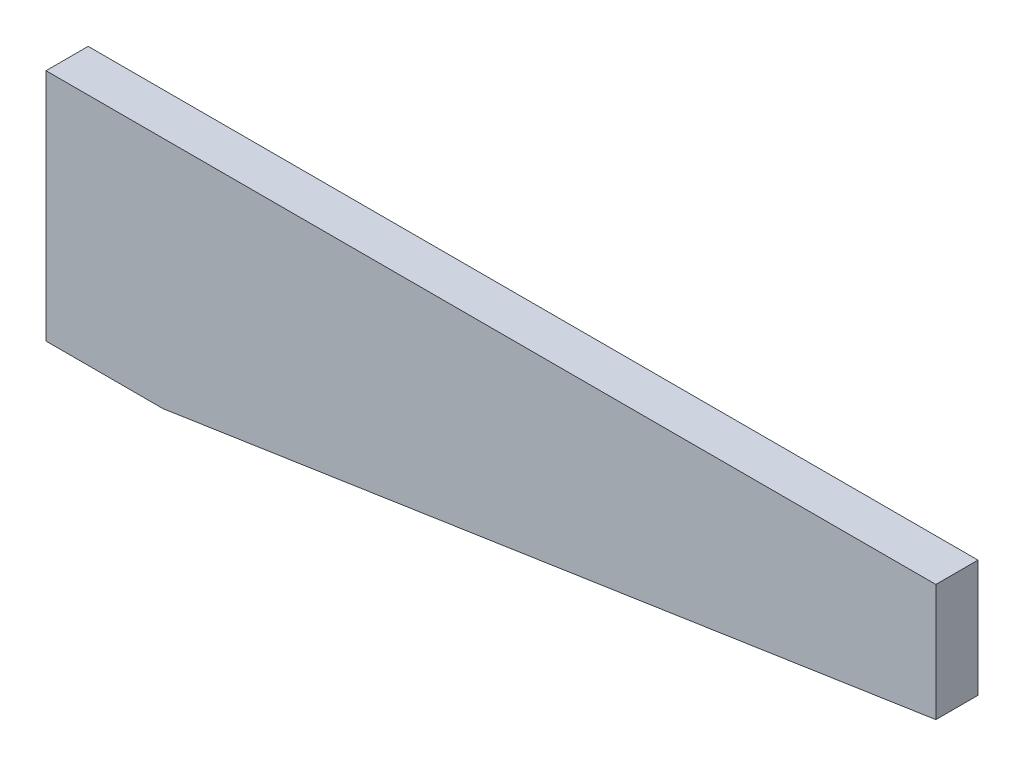
ISO-10303-21;
HEADER;
FILE_DESCRIPTION(('STEP AP214'),'2;1');
FILE_NAME('part.step','',(''),(''),'','','');
FILE_SCHEMA(('AUTOMOTIVE_DESIGN { 1 0 10303 214 1 1 1 1 }'));
ENDSEC;
DATA;
#1=APPLICATION_CONTEXT('core data for automotive mechanical design processes');
#2=APPLICATION_PROTOCOL_DEFINITION('international standard','automotive_design',2000,#1);
#3=PRODUCT_CONTEXT('',#1,'mechanical');
#4=PRODUCT('Part','Part','',(#3));
#5=PRODUCT_RELATED_PRODUCT_CATEGORY('part','',(#4));
#6=PRODUCT_DEFINITION_FORMATION('','',#4);
#7=PRODUCT_DEFINITION_CONTEXT('part definition',#1,'design');
#8=PRODUCT_DEFINITION('design','',#6,#7);
#9=PRODUCT_DEFINITION_SHAPE('','',#8);
#10=(LENGTH_UNIT() NAMED_UNIT(*) SI_UNIT(.MILLI.,.METRE.));
#11=(NAMED_UNIT(*) PLANE_ANGLE_UNIT() SI_UNIT($,.RADIAN.));
#12=(NAMED_UNIT(*) SI_UNIT($,.STERADIAN.) SOLID_ANGLE_UNIT());
#13=UNCERTAINTY_MEASURE_WITH_UNIT(LENGTH_MEASURE(1.E-05),#10,'distance_accuracy_value','');
#14=(GEOMETRIC_REPRESENTATION_CONTEXT(3) GLOBAL_UNCERTAINTY_ASSIGNED_CONTEXT((#13)) GLOBAL_UNIT_ASSIGNED_CONTEXT((#10,
#11,#12)) REPRESENTATION_CONTEXT('',''));
#15=CARTESIAN_POINT('',(0.,0.,0.));
#16=DIRECTION('',(0.,0.,1.));
#17=DIRECTION('',(1.,0.,0.));
#18=AXIS2_PLACEMENT_3D('',#15,#16,#17);
#19=CARTESIAN_POINT('',(0.,0.,27.));
#20=DIRECTION('',(1.,0.,0.));
#21=DIRECTION('',(0.,0.,-1.));
#22=AXIS2_PLACEMENT_3D('',#19,#20,#21);
#23=PLANE('',#22);
#24=DIRECTION('',(0.,-1.,0.));
#25=VECTOR('',#24,1.);
#26=CARTESIAN_POINT('',(0.,0.,0.));
#27=LINE('',#26,#25);
#28=CARTESIAN_POINT('',(0.,150.,0.));
#29=VERTEX_POINT('',#28);
#30=CARTESIAN_POINT('',(0.,0.,0.));
#31=VERTEX_POINT('',#30);
#32=EDGE_CURVE('E92',#29,#31,#27,.T.);
#33=ORIENTED_EDGE('',*,*,#32,.T.);
#34=DIRECTION('',(0.,0.,-1.));
#35=VECTOR('',#34,1.);
#36=CARTESIAN_POINT('',(0.,0.,27.));
#37=LINE('',#36,#35);
#38=CARTESIAN_POINT('',(0.,0.,27.));
#39=VERTEX_POINT('',#38);
#40=EDGE_CURVE('E11',#39,#31,#37,.T.);
#41=ORIENTED_EDGE('',*,*,#40,.F.);
#42=DIRECTION('',(0.,-1.,0.));
#43=VECTOR('',#42,1.);
#44=CARTESIAN_POINT('',(0.,0.,27.));
#45=LINE('',#44,#43);
#46=CARTESIAN_POINT('',(0.,150.,27.));
#47=VERTEX_POINT('',#46);
#48=EDGE_CURVE('E100',#47,#39,#45,.T.);
#49=ORIENTED_EDGE('',*,*,#48,.F.);
#50=DIRECTION('',(0.,0.,-1.));
#51=VECTOR('',#50,1.);
#52=CARTESIAN_POINT('',(0.,150.,27.));
#53=LINE('',#52,#51);
#54=EDGE_CURVE('E112',#47,#29,#53,.T.);
#55=ORIENTED_EDGE('',*,*,#54,.T.);
#56=EDGE_LOOP('',(#33,#41,#49,#55));
#57=FACE_BOUND('',#56,.T.);
#58=ADVANCED_FACE('F33',(#57),#23,.F.);
#59=CARTESIAN_POINT('',(0.,0.,27.));
#60=DIRECTION('',(0.,1.,0.));
#61=DIRECTION('',(0.,0.,1.));
#62=AXIS2_PLACEMENT_3D('',#59,#60,#61);
#63=PLANE('',#62);
#64=DIRECTION('',(1.,0.,0.));
#65=VECTOR('',#64,1.);
#66=CARTESIAN_POINT('',(0.,0.,0.));
#67=LINE('',#66,#65);
#68=CARTESIAN_POINT('',(75.,0.,0.));
#69=VERTEX_POINT('',#68);
#70=EDGE_CURVE('E96',#31,#69,#67,.T.);
#71=ORIENTED_EDGE('',*,*,#70,.T.);
#72=DIRECTION('',(0.,0.,1.));
#73=VECTOR('',#72,1.);
#74=CARTESIAN_POINT('',(75.,0.,0.));
#75=LINE('',#74,#73);
#76=CARTESIAN_POINT('',(75.,0.,27.000006));
#77=VERTEX_POINT('',#76);
#78=EDGE_CURVE('E49',#69,#77,#75,.T.);
#79=ORIENTED_EDGE('',*,*,#78,.T.);
#80=DIRECTION('',(1.,0.,0.));
#81=VECTOR('',#80,1.);
#82=CARTESIAN_POINT('',(0.,0.,27.));
#83=LINE('',#82,#81);
#84=EDGE_CURVE('E36',#39,#77,#83,.T.);
#85=ORIENTED_EDGE('',*,*,#84,.F.);
#86=ORIENTED_EDGE('',*,*,#40,.T.);
#87=EDGE_LOOP('',(#71,#79,#85,#86));
#88=FACE_BOUND('',#87,.T.);
#89=ADVANCED_FACE('F95',(#88),#63,.F.);
#90=CARTESIAN_POINT('',(570.,0.,27.));
#91=DIRECTION('',(-1.,0.,0.));
#92=DIRECTION('',(0.,0.,1.));
#93=AXIS2_PLACEMENT_3D('',#90,#91,#92);
#94=PLANE('',#93);
#95=DIRECTION('',(0.,1.,0.));
#96=VECTOR('',#95,1.);
#97=CARTESIAN_POINT('',(570.,0.,27.));
#98=LINE('',#97,#96);
#99=CARTESIAN_POINT('',(570.,75.,27.));
#100=VERTEX_POINT('',#99);
#101=CARTESIAN_POINT('',(570.,150.,27.));
#102=VERTEX_POINT('',#101);
#103=EDGE_CURVE('E102',#100,#102,#98,.T.);
#104=ORIENTED_EDGE('',*,*,#103,.F.);
#105=DIRECTION('',(0.,0.,1.));
#106=VECTOR('',#105,1.);
#107=CARTESIAN_POINT('',(570.,75.,0.));
#108=LINE('',#107,#106);
#109=CARTESIAN_POINT('',(570.,75.,0.));
#110=VERTEX_POINT('',#109);
#111=EDGE_CURVE('E90',#110,#100,#108,.T.);
#112=ORIENTED_EDGE('',*,*,#111,.F.);
#113=DIRECTION('',(0.,1.,0.));
#114=VECTOR('',#113,1.);
#115=CARTESIAN_POINT('',(570.,0.,0.));
#116=LINE('',#115,#114);
#117=CARTESIAN_POINT('',(570.,150.,0.));
#118=VERTEX_POINT('',#117);
#119=EDGE_CURVE('E105',#110,#118,#116,.T.);
#120=ORIENTED_EDGE('',*,*,#119,.T.);
#121=DIRECTION('',(0.,0.,-1.));
#122=VECTOR('',#121,1.);
#123=CARTESIAN_POINT('',(570.,150.,27.));
#124=LINE('',#123,#122);
#125=EDGE_CURVE('E42',#102,#118,#124,.T.);
#126=ORIENTED_EDGE('',*,*,#125,.F.);
#127=EDGE_LOOP('',(#104,#112,#120,#126));
#128=FACE_BOUND('',#127,.T.);
#129=ADVANCED_FACE('F130',(#128),#94,.F.);
#130=CARTESIAN_POINT('',(0.,150.,27.));
#131=DIRECTION('',(0.,-1.,0.));
#132=DIRECTION('',(0.,0.,-1.));
#133=AXIS2_PLACEMENT_3D('',#130,#131,#132);
#134=PLANE('',#133);
#135=DIRECTION('',(-1.,0.,0.));
#136=VECTOR('',#135,1.);
#137=CARTESIAN_POINT('',(0.,150.,0.));
#138=LINE('',#137,#136);
#139=EDGE_CURVE('E75',#118,#29,#138,.T.);
#140=ORIENTED_EDGE('',*,*,#139,.T.);
#141=ORIENTED_EDGE('',*,*,#54,.F.);
#142=DIRECTION('',(-1.,0.,0.));
#143=VECTOR('',#142,1.);
#144=CARTESIAN_POINT('',(0.,150.,27.));
#145=LINE('',#144,#143);
#146=EDGE_CURVE('E58',#102,#47,#145,.T.);
#147=ORIENTED_EDGE('',*,*,#146,.F.);
#148=ORIENTED_EDGE('',*,*,#125,.T.);
#149=EDGE_LOOP('',(#140,#141,#147,#148));
#150=FACE_BOUND('',#149,.T.);
#151=ADVANCED_FACE('F119',(#150),#134,.F.);
#152=CARTESIAN_POINT('',(0.,0.,27.));
#153=DIRECTION('',(0.,0.,-1.));
#154=DIRECTION('',(-1.,0.,0.));
#155=AXIS2_PLACEMENT_3D('',#152,#153,#154);
#156=PLANE('',#155);
#157=ORIENTED_EDGE('',*,*,#84,.T.);
#158=DIRECTION('',(0.988715504224767,0.149805379427995,0.));
#159=VECTOR('',#158,1.);
#160=CARTESIAN_POINT('',(1.68312387791741,-11.1086175942549,27.));
#161=LINE('',#160,#159);
#162=EDGE_CURVE('E87',#77,#100,#161,.T.);
#163=ORIENTED_EDGE('',*,*,#162,.T.);
#164=ORIENTED_EDGE('',*,*,#103,.T.);
#165=ORIENTED_EDGE('',*,*,#146,.T.);
#166=ORIENTED_EDGE('',*,*,#48,.T.);
#167=EDGE_LOOP('',(#157,#163,#164,#165,#166));
#168=FACE_BOUND('',#167,.T.);
#169=ADVANCED_FACE('F98',(#168),#156,.F.);
#170=CARTESIAN_POINT('',(0.,0.,0.));
#171=DIRECTION('',(0.,0.,-1.));
#172=DIRECTION('',(-1.,0.,0.));
#173=AXIS2_PLACEMENT_3D('',#170,#171,#172);
#174=PLANE('',#173);
#175=DIRECTION('',(-0.988715504224767,-0.149805379427995,0.));
#176=VECTOR('',#175,1.);
#177=CARTESIAN_POINT('',(75.,0.,0.));
#178=LINE('',#177,#176);
#179=EDGE_CURVE('E181',#110,#69,#178,.T.);
#180=ORIENTED_EDGE('',*,*,#179,.T.);
#181=ORIENTED_EDGE('',*,*,#70,.F.);
#182=ORIENTED_EDGE('',*,*,#32,.F.);
#183=ORIENTED_EDGE('',*,*,#139,.F.);
#184=ORIENTED_EDGE('',*,*,#119,.F.);
#185=EDGE_LOOP('',(#180,#181,#182,#183,#184));
#186=FACE_BOUND('',#185,.T.);
#187=ADVANCED_FACE('F124',(#186),#174,.T.);
#188=CARTESIAN_POINT('',(75.,0.,0.));
#189=DIRECTION('',(-0.149805379427995,0.988715504224767,0.));
#190=DIRECTION('',(-0.988715504224767,-0.149805379427995,0.));
#191=AXIS2_PLACEMENT_3D('',#188,#189,#190);
#192=PLANE('',#191);
#193=ORIENTED_EDGE('',*,*,#78,.F.);
#194=ORIENTED_EDGE('',*,*,#179,.F.);
#195=ORIENTED_EDGE('',*,*,#111,.T.);
#196=ORIENTED_EDGE('',*,*,#162,.F.);
#197=EDGE_LOOP('',(#193,#194,#195,#196));
#198=FACE_BOUND('',#197,.T.);
#199=ADVANCED_FACE('F88',(#198),#192,.F.);
#200=CLOSED_SHELL('',(#58,#89,#129,#151,#169,#187,#199));
#201=MANIFOLD_SOLID_BREP('B2',#200);
#202=ADVANCED_BREP_SHAPE_REPRESENTATION('',(#18,#201),#14);
#203=SHAPE_DEFINITION_REPRESENTATION(#9,#202);
ENDSEC;
END-ISO-10303-21;
